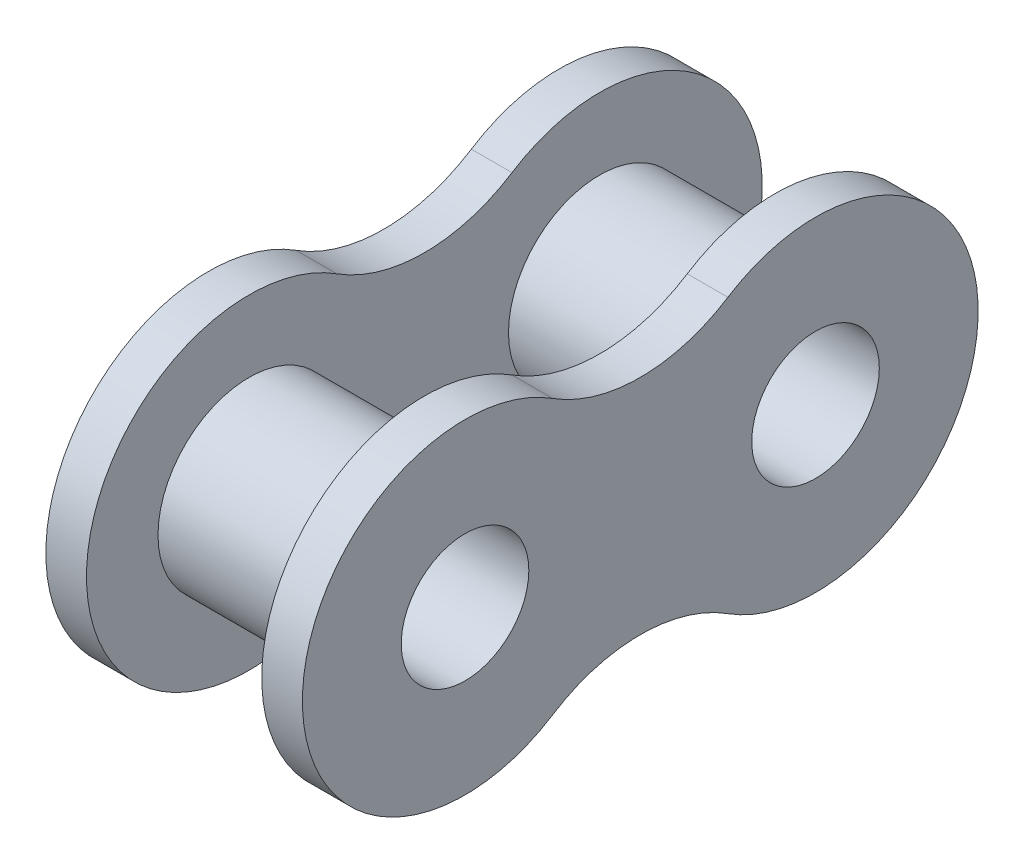
ISO-10303-21;
HEADER;
FILE_DESCRIPTION(('STEP AP214'),'2;1');
FILE_NAME('part.step','',(''),(''),'','','');
FILE_SCHEMA(('AUTOMOTIVE_DESIGN { 1 0 10303 214 1 1 1 1 }'));
ENDSEC;
DATA;
#1=APPLICATION_CONTEXT('core data for automotive mechanical design processes');
#2=APPLICATION_PROTOCOL_DEFINITION('international standard','automotive_design',2000,#1);
#3=PRODUCT_CONTEXT('',#1,'mechanical');
#4=PRODUCT('Part','Part','',(#3));
#5=PRODUCT_RELATED_PRODUCT_CATEGORY('part','',(#4));
#6=PRODUCT_DEFINITION_FORMATION('','',#4);
#7=PRODUCT_DEFINITION_CONTEXT('part definition',#1,'design');
#8=PRODUCT_DEFINITION('design','',#6,#7);
#9=PRODUCT_DEFINITION_SHAPE('','',#8);
#10=(LENGTH_UNIT() NAMED_UNIT(*) SI_UNIT(.MILLI.,.METRE.));
#11=(NAMED_UNIT(*) PLANE_ANGLE_UNIT() SI_UNIT($,.RADIAN.));
#12=(NAMED_UNIT(*) SI_UNIT($,.STERADIAN.) SOLID_ANGLE_UNIT());
#13=UNCERTAINTY_MEASURE_WITH_UNIT(LENGTH_MEASURE(1.E-05),#10,'distance_accuracy_value','');
#14=(GEOMETRIC_REPRESENTATION_CONTEXT(3) GLOBAL_UNCERTAINTY_ASSIGNED_CONTEXT((#13)) GLOBAL_UNIT_ASSIGNED_CONTEXT((#10,
#11,#12)) REPRESENTATION_CONTEXT('',''));
#15=CARTESIAN_POINT('',(0.,0.,0.));
#16=DIRECTION('',(0.,0.,1.));
#17=DIRECTION('',(1.,0.,0.));
#18=AXIS2_PLACEMENT_3D('',#15,#16,#17);
#19=CARTESIAN_POINT('',(0.7366,2.48215968664387,-4.7625));
#20=DIRECTION('',(1.,0.,0.));
#21=DIRECTION('',(0.,0.,-1.));
#22=AXIS2_PLACEMENT_3D('',#19,#20,#21);
#23=PLANE('',#22);
#24=CARTESIAN_POINT('',(0.7366,0.,0.));
#25=DIRECTION('',(1.,0.,0.));
#26=DIRECTION('',(0.,0.,-1.));
#27=AXIS2_PLACEMENT_3D('',#24,#25,#26);
#28=CIRCLE('',#27,1.651);
#29=CARTESIAN_POINT('',(0.7366,0.,-1.651));
#30=VERTEX_POINT('',#29);
#31=EDGE_CURVE('E197',#30,#30,#28,.T.);
#32=ORIENTED_EDGE('',*,*,#31,.F.);
#33=EDGE_LOOP('',(#32));
#34=FACE_BOUND('',#33,.T.);
#35=CARTESIAN_POINT('',(0.7366,4.96431937328774,-3.175));
#36=DIRECTION('',(-1.,0.,0.));
#37=DIRECTION('',(0.,0.,-1.));
#38=AXIS2_PLACEMENT_3D('',#35,#36,#37);
#39=CIRCLE('',#38,2.9464);
#40=CARTESIAN_POINT('',(0.7366,2.48215968664387,-4.7625));
#41=VERTEX_POINT('',#40);
#42=CARTESIAN_POINT('',(0.7366,2.48215968664387,-1.5875));
#43=VERTEX_POINT('',#42);
#44=EDGE_CURVE('E217',#41,#43,#39,.T.);
#45=ORIENTED_EDGE('',*,*,#44,.T.);
#46=CARTESIAN_POINT('',(0.7366,0.,0.));
#47=DIRECTION('',(1.,0.,0.));
#48=DIRECTION('',(0.,0.,-1.));
#49=AXIS2_PLACEMENT_3D('',#46,#47,#48);
#50=CIRCLE('',#49,2.9464);
#51=CARTESIAN_POINT('',(0.7366,-2.48215968664387,-1.5875));
#52=VERTEX_POINT('',#51);
#53=EDGE_CURVE('E101',#43,#52,#50,.T.);
#54=ORIENTED_EDGE('',*,*,#53,.T.);
#55=CARTESIAN_POINT('',(0.7366,-4.96431937328774,-3.175));
#56=DIRECTION('',(-1.,0.,0.));
#57=DIRECTION('',(0.,0.,1.));
#58=AXIS2_PLACEMENT_3D('',#55,#56,#57);
#59=CIRCLE('',#58,2.9464);
#60=CARTESIAN_POINT('',(0.7366,-2.48215968664387,-4.7625));
#61=VERTEX_POINT('',#60);
#62=EDGE_CURVE('E222',#52,#61,#59,.T.);
#63=ORIENTED_EDGE('',*,*,#62,.T.);
#64=CARTESIAN_POINT('',(0.7366,0.,-6.35));
#65=DIRECTION('',(1.,0.,0.));
#66=DIRECTION('',(0.,0.,-1.));
#67=AXIS2_PLACEMENT_3D('',#64,#65,#66);
#68=CIRCLE('',#67,2.9464);
#69=EDGE_CURVE('E64',#61,#41,#68,.T.);
#70=ORIENTED_EDGE('',*,*,#69,.T.);
#71=EDGE_LOOP('',(#45,#54,#63,#70));
#72=FACE_BOUND('',#71,.T.);
#73=CARTESIAN_POINT('',(0.7366,0.,-6.35));
#74=DIRECTION('',(1.,0.,0.));
#75=DIRECTION('',(0.,0.,-1.));
#76=AXIS2_PLACEMENT_3D('',#73,#74,#75);
#77=CIRCLE('',#76,1.651);
#78=CARTESIAN_POINT('',(0.7366,0.,-8.001));
#79=VERTEX_POINT('',#78);
#80=EDGE_CURVE('E193',#79,#79,#77,.T.);
#81=ORIENTED_EDGE('',*,*,#80,.F.);
#82=EDGE_LOOP('',(#81));
#83=FACE_BOUND('',#82,.T.);
#84=ADVANCED_FACE('F43',(#34,#72,#83),#23,.T.);
#85=CARTESIAN_POINT('',(0.,2.48215968664387,-4.7625));
#86=DIRECTION('',(1.,0.,0.));
#87=DIRECTION('',(0.,0.,-1.));
#88=AXIS2_PLACEMENT_3D('',#85,#86,#87);
#89=PLANE('',#88);
#90=CARTESIAN_POINT('',(0.,4.96431937328774,-3.175));
#91=DIRECTION('',(-1.,0.,0.));
#92=DIRECTION('',(0.,0.,-1.));
#93=AXIS2_PLACEMENT_3D('',#90,#91,#92);
#94=CIRCLE('',#93,2.9464);
#95=CARTESIAN_POINT('',(0.,2.48215968664387,-4.7625));
#96=VERTEX_POINT('',#95);
#97=CARTESIAN_POINT('',(0.,2.48215968664387,-1.5875));
#98=VERTEX_POINT('',#97);
#99=EDGE_CURVE('E216',#96,#98,#94,.T.);
#100=ORIENTED_EDGE('',*,*,#99,.F.);
#101=CARTESIAN_POINT('',(0.,0.,-6.35));
#102=DIRECTION('',(1.,0.,0.));
#103=DIRECTION('',(0.,0.,-1.));
#104=AXIS2_PLACEMENT_3D('',#101,#102,#103);
#105=CIRCLE('',#104,2.9464);
#106=CARTESIAN_POINT('',(0.,-2.48215968664387,-4.7625));
#107=VERTEX_POINT('',#106);
#108=EDGE_CURVE('E94',#107,#96,#105,.T.);
#109=ORIENTED_EDGE('',*,*,#108,.F.);
#110=CARTESIAN_POINT('',(0.,-4.96431937328774,-3.175));
#111=DIRECTION('',(-1.,0.,0.));
#112=DIRECTION('',(0.,0.,1.));
#113=AXIS2_PLACEMENT_3D('',#110,#111,#112);
#114=CIRCLE('',#113,2.9464);
#115=CARTESIAN_POINT('',(0.,-2.48215968664387,-1.5875));
#116=VERTEX_POINT('',#115);
#117=EDGE_CURVE('E87',#116,#107,#114,.T.);
#118=ORIENTED_EDGE('',*,*,#117,.F.);
#119=CARTESIAN_POINT('',(0.,0.,0.));
#120=DIRECTION('',(1.,0.,0.));
#121=DIRECTION('',(0.,0.,-1.));
#122=AXIS2_PLACEMENT_3D('',#119,#120,#121);
#123=CIRCLE('',#122,2.9464);
#124=EDGE_CURVE('E231',#98,#116,#123,.T.);
#125=ORIENTED_EDGE('',*,*,#124,.F.);
#126=EDGE_LOOP('',(#100,#109,#118,#125));
#127=FACE_BOUND('',#126,.T.);
#128=CARTESIAN_POINT('',(0.,0.,0.));
#129=DIRECTION('',(1.,0.,0.));
#130=DIRECTION('',(0.,0.,-1.));
#131=AXIS2_PLACEMENT_3D('',#128,#129,#130);
#132=CIRCLE('',#131,1.1557);
#133=CARTESIAN_POINT('',(0.,0.,-1.1557));
#134=VERTEX_POINT('',#133);
#135=EDGE_CURVE('E212',#134,#134,#132,.T.);
#136=ORIENTED_EDGE('',*,*,#135,.T.);
#137=EDGE_LOOP('',(#136));
#138=FACE_BOUND('',#137,.T.);
#139=CARTESIAN_POINT('',(0.,0.,-6.35));
#140=DIRECTION('',(1.,0.,0.));
#141=DIRECTION('',(0.,0.,-1.));
#142=AXIS2_PLACEMENT_3D('',#139,#140,#141);
#143=CIRCLE('',#142,1.1557);
#144=CARTESIAN_POINT('',(0.,0.,-7.5057));
#145=VERTEX_POINT('',#144);
#146=EDGE_CURVE('E205',#145,#145,#143,.T.);
#147=ORIENTED_EDGE('',*,*,#146,.T.);
#148=EDGE_LOOP('',(#147));
#149=FACE_BOUND('',#148,.T.);
#150=ADVANCED_FACE('F246',(#127,#138,#149),#89,.F.);
#151=CARTESIAN_POINT('',(0.7366,4.96431937328774,-3.175));
#152=DIRECTION('',(-1.,0.,0.));
#153=DIRECTION('',(0.,0.,1.));
#154=AXIS2_PLACEMENT_3D('',#151,#152,#153);
#155=CYLINDRICAL_SURFACE('',#154,2.9464);
#156=ORIENTED_EDGE('',*,*,#99,.T.);
#157=DIRECTION('',(-1.,0.,0.));
#158=VECTOR('',#157,1.);
#159=CARTESIAN_POINT('',(0.7366,2.48215968664387,-1.5875));
#160=LINE('',#159,#158);
#161=EDGE_CURVE('E11',#43,#98,#160,.T.);
#162=ORIENTED_EDGE('',*,*,#161,.F.);
#163=ORIENTED_EDGE('',*,*,#44,.F.);
#164=DIRECTION('',(-1.,0.,0.));
#165=VECTOR('',#164,1.);
#166=CARTESIAN_POINT('',(0.7366,2.48215968664387,-4.7625));
#167=LINE('',#166,#165);
#168=EDGE_CURVE('E227',#41,#96,#167,.T.);
#169=ORIENTED_EDGE('',*,*,#168,.T.);
#170=EDGE_LOOP('',(#156,#162,#163,#169));
#171=FACE_BOUND('',#170,.T.);
#172=ADVANCED_FACE('F45',(#171),#155,.F.);
#173=CARTESIAN_POINT('',(0.7366,0.,0.));
#174=DIRECTION('',(-1.,0.,0.));
#175=DIRECTION('',(0.,0.,1.));
#176=AXIS2_PLACEMENT_3D('',#173,#174,#175);
#177=CYLINDRICAL_SURFACE('',#176,2.9464);
#178=ORIENTED_EDGE('',*,*,#124,.T.);
#179=DIRECTION('',(-1.,0.,0.));
#180=VECTOR('',#179,1.);
#181=CARTESIAN_POINT('',(0.7366,-2.48215968664387,-1.5875));
#182=LINE('',#181,#180);
#183=EDGE_CURVE('E53',#52,#116,#182,.T.);
#184=ORIENTED_EDGE('',*,*,#183,.F.);
#185=ORIENTED_EDGE('',*,*,#53,.F.);
#186=ORIENTED_EDGE('',*,*,#161,.T.);
#187=EDGE_LOOP('',(#178,#184,#185,#186));
#188=FACE_BOUND('',#187,.T.);
#189=ADVANCED_FACE('F262',(#188),#177,.T.);
#190=CARTESIAN_POINT('',(0.7366,-4.96431937328774,-3.175));
#191=DIRECTION('',(-1.,0.,0.));
#192=DIRECTION('',(0.,0.,1.));
#193=AXIS2_PLACEMENT_3D('',#190,#191,#192);
#194=CYLINDRICAL_SURFACE('',#193,2.9464);
#195=ORIENTED_EDGE('',*,*,#117,.T.);
#196=DIRECTION('',(-1.,0.,0.));
#197=VECTOR('',#196,1.);
#198=CARTESIAN_POINT('',(0.7366,-2.48215968664387,-4.7625));
#199=LINE('',#198,#197);
#200=EDGE_CURVE('E239',#61,#107,#199,.T.);
#201=ORIENTED_EDGE('',*,*,#200,.F.);
#202=ORIENTED_EDGE('',*,*,#62,.F.);
#203=ORIENTED_EDGE('',*,*,#183,.T.);
#204=EDGE_LOOP('',(#195,#201,#202,#203));
#205=FACE_BOUND('',#204,.T.);
#206=ADVANCED_FACE('F243',(#205),#194,.F.);
#207=CARTESIAN_POINT('',(0.7366,0.,-6.35));
#208=DIRECTION('',(-1.,0.,0.));
#209=DIRECTION('',(0.,0.,1.));
#210=AXIS2_PLACEMENT_3D('',#207,#208,#209);
#211=CYLINDRICAL_SURFACE('',#210,2.9464);
#212=ORIENTED_EDGE('',*,*,#108,.T.);
#213=ORIENTED_EDGE('',*,*,#168,.F.);
#214=ORIENTED_EDGE('',*,*,#69,.F.);
#215=ORIENTED_EDGE('',*,*,#200,.T.);
#216=EDGE_LOOP('',(#212,#213,#214,#215));
#217=FACE_BOUND('',#216,.T.);
#218=ADVANCED_FACE('F251',(#217),#211,.T.);
#219=CARTESIAN_POINT('',(0.7366,0.,0.));
#220=DIRECTION('',(-1.,0.,0.));
#221=DIRECTION('',(0.,0.,1.));
#222=AXIS2_PLACEMENT_3D('',#219,#220,#221);
#223=CYLINDRICAL_SURFACE('',#222,1.1557);
#224=ORIENTED_EDGE('',*,*,#135,.F.);
#225=EDGE_LOOP('',(#224));
#226=FACE_BOUND('',#225,.T.);
#227=CARTESIAN_POINT('',(4.6482,0.,0.));
#228=DIRECTION('',(1.,0.,0.));
#229=DIRECTION('',(0.,0.,-1.));
#230=AXIS2_PLACEMENT_3D('',#227,#228,#229);
#231=CIRCLE('',#230,1.1557);
#232=CARTESIAN_POINT('',(4.6482,0.,-1.1557));
#233=VERTEX_POINT('',#232);
#234=EDGE_CURVE('E177',#233,#233,#231,.T.);
#235=ORIENTED_EDGE('',*,*,#234,.T.);
#236=EDGE_LOOP('',(#235));
#237=FACE_BOUND('',#236,.T.);
#238=ADVANCED_FACE('F253',(#226,#237),#223,.F.);
#239=CARTESIAN_POINT('',(0.7366,0.,-6.35));
#240=DIRECTION('',(-1.,0.,0.));
#241=DIRECTION('',(0.,0.,1.));
#242=AXIS2_PLACEMENT_3D('',#239,#240,#241);
#243=CYLINDRICAL_SURFACE('',#242,1.1557);
#244=ORIENTED_EDGE('',*,*,#146,.F.);
#245=EDGE_LOOP('',(#244));
#246=FACE_BOUND('',#245,.T.);
#247=CARTESIAN_POINT('',(4.6482,0.,-6.35));
#248=DIRECTION('',(1.,0.,0.));
#249=DIRECTION('',(0.,0.,-1.));
#250=AXIS2_PLACEMENT_3D('',#247,#248,#249);
#251=CIRCLE('',#250,1.1557);
#252=CARTESIAN_POINT('',(4.6482,0.,-7.5057));
#253=VERTEX_POINT('',#252);
#254=EDGE_CURVE('E462',#253,#253,#251,.T.);
#255=ORIENTED_EDGE('',*,*,#254,.T.);
#256=EDGE_LOOP('',(#255));
#257=FACE_BOUND('',#256,.T.);
#258=ADVANCED_FACE('F259',(#246,#257),#243,.F.);
#259=CARTESIAN_POINT('',(3.9116,0.,0.));
#260=DIRECTION('',(-1.,0.,0.));
#261=DIRECTION('',(0.,0.,1.));
#262=AXIS2_PLACEMENT_3D('',#259,#260,#261);
#263=CYLINDRICAL_SURFACE('',#262,1.651);
#264=CARTESIAN_POINT('',(3.9116,0.,0.));
#265=DIRECTION('',(1.,0.,0.));
#266=DIRECTION('',(0.,0.,-1.));
#267=AXIS2_PLACEMENT_3D('',#264,#265,#266);
#268=CIRCLE('',#267,1.651);
#269=CARTESIAN_POINT('',(3.9116,0.,-1.651));
#270=VERTEX_POINT('',#269);
#271=EDGE_CURVE('E201',#270,#270,#268,.T.);
#272=ORIENTED_EDGE('',*,*,#271,.F.);
#273=EDGE_LOOP('',(#272));
#274=FACE_BOUND('',#273,.T.);
#275=ORIENTED_EDGE('',*,*,#31,.T.);
#276=EDGE_LOOP('',(#275));
#277=FACE_BOUND('',#276,.T.);
#278=ADVANCED_FACE('F275',(#274,#277),#263,.T.);
#279=CARTESIAN_POINT('',(3.9116,0.,-6.35));
#280=DIRECTION('',(-1.,0.,0.));
#281=DIRECTION('',(0.,0.,1.));
#282=AXIS2_PLACEMENT_3D('',#279,#280,#281);
#283=CYLINDRICAL_SURFACE('',#282,1.651);
#284=CARTESIAN_POINT('',(3.9116,0.,-6.35));
#285=DIRECTION('',(1.,0.,0.));
#286=DIRECTION('',(0.,0.,-1.));
#287=AXIS2_PLACEMENT_3D('',#284,#285,#286);
#288=CIRCLE('',#287,1.651);
#289=CARTESIAN_POINT('',(3.9116,0.,-8.001));
#290=VERTEX_POINT('',#289);
#291=EDGE_CURVE('E147',#290,#290,#288,.T.);
#292=ORIENTED_EDGE('',*,*,#291,.F.);
#293=EDGE_LOOP('',(#292));
#294=FACE_BOUND('',#293,.T.);
#295=ORIENTED_EDGE('',*,*,#80,.T.);
#296=EDGE_LOOP('',(#295));
#297=FACE_BOUND('',#296,.T.);
#298=ADVANCED_FACE('F279',(#294,#297),#283,.T.);
#299=CARTESIAN_POINT('',(3.9116,4.96431937328774,-3.175));
#300=DIRECTION('',(1.,0.,0.));
#301=DIRECTION('',(0.,0.,-1.));
#302=AXIS2_PLACEMENT_3D('',#299,#300,#301);
#303=CYLINDRICAL_SURFACE('',#302,2.9464);
#304=CARTESIAN_POINT('',(4.6482,4.96431937328774,-3.175));
#305=DIRECTION('',(-1.,0.,0.));
#306=DIRECTION('',(0.,0.,-1.));
#307=AXIS2_PLACEMENT_3D('',#304,#305,#306);
#308=CIRCLE('',#307,2.9464);
#309=CARTESIAN_POINT('',(4.6482,2.48215968664387,-4.7625));
#310=VERTEX_POINT('',#309);
#311=CARTESIAN_POINT('',(4.6482,2.48215968664387,-1.5875));
#312=VERTEX_POINT('',#311);
#313=EDGE_CURVE('E141',#310,#312,#308,.T.);
#314=ORIENTED_EDGE('',*,*,#313,.F.);
#315=DIRECTION('',(1.,0.,0.));
#316=VECTOR('',#315,1.);
#317=CARTESIAN_POINT('',(3.9116,2.48215968664387,-4.7625));
#318=LINE('',#317,#316);
#319=CARTESIAN_POINT('',(3.9116,2.48215968664387,-4.7625));
#320=VERTEX_POINT('',#319);
#321=EDGE_CURVE('E135',#320,#310,#318,.T.);
#322=ORIENTED_EDGE('',*,*,#321,.F.);
#323=CARTESIAN_POINT('',(3.9116,4.96431937328774,-3.175));
#324=DIRECTION('',(-1.,0.,0.));
#325=DIRECTION('',(0.,0.,-1.));
#326=AXIS2_PLACEMENT_3D('',#323,#324,#325);
#327=CIRCLE('',#326,2.9464);
#328=CARTESIAN_POINT('',(3.9116,2.48215968664387,-1.5875));
#329=VERTEX_POINT('',#328);
#330=EDGE_CURVE('E138',#320,#329,#327,.T.);
#331=ORIENTED_EDGE('',*,*,#330,.T.);
#332=DIRECTION('',(1.,0.,0.));
#333=VECTOR('',#332,1.);
#334=CARTESIAN_POINT('',(3.9116,2.48215968664387,-1.5875));
#335=LINE('',#334,#333);
#336=EDGE_CURVE('E173',#329,#312,#335,.T.);
#337=ORIENTED_EDGE('',*,*,#336,.T.);
#338=EDGE_LOOP('',(#314,#322,#331,#337));
#339=FACE_BOUND('',#338,.T.);
#340=ADVANCED_FACE('F137',(#339),#303,.F.);
#341=CARTESIAN_POINT('',(3.9116,0.,-6.35));
#342=DIRECTION('',(1.,0.,0.));
#343=DIRECTION('',(0.,0.,-1.));
#344=AXIS2_PLACEMENT_3D('',#341,#342,#343);
#345=CYLINDRICAL_SURFACE('',#344,2.9464);
#346=CARTESIAN_POINT('',(4.6482,0.,-6.35));
#347=DIRECTION('',(1.,0.,0.));
#348=DIRECTION('',(0.,0.,-1.));
#349=AXIS2_PLACEMENT_3D('',#346,#347,#348);
#350=CIRCLE('',#349,2.9464);
#351=CARTESIAN_POINT('',(4.6482,-2.48215968664387,-4.7625));
#352=VERTEX_POINT('',#351);
#353=EDGE_CURVE('E176',#352,#310,#350,.T.);
#354=ORIENTED_EDGE('',*,*,#353,.F.);
#355=DIRECTION('',(1.,0.,0.));
#356=VECTOR('',#355,1.);
#357=CARTESIAN_POINT('',(3.9116,-2.48215968664387,-4.7625));
#358=LINE('',#357,#356);
#359=CARTESIAN_POINT('',(3.9116,-2.48215968664387,-4.7625));
#360=VERTEX_POINT('',#359);
#361=EDGE_CURVE('E148',#360,#352,#358,.T.);
#362=ORIENTED_EDGE('',*,*,#361,.F.);
#363=CARTESIAN_POINT('',(3.9116,0.,-6.35));
#364=DIRECTION('',(1.,0.,0.));
#365=DIRECTION('',(0.,0.,-1.));
#366=AXIS2_PLACEMENT_3D('',#363,#364,#365);
#367=CIRCLE('',#366,2.9464);
#368=EDGE_CURVE('E154',#360,#320,#367,.T.);
#369=ORIENTED_EDGE('',*,*,#368,.T.);
#370=ORIENTED_EDGE('',*,*,#321,.T.);
#371=EDGE_LOOP('',(#354,#362,#369,#370));
#372=FACE_BOUND('',#371,.T.);
#373=ADVANCED_FACE('F161',(#372),#345,.T.);
#374=CARTESIAN_POINT('',(3.9116,-4.96431937328774,-3.175));
#375=DIRECTION('',(1.,0.,0.));
#376=DIRECTION('',(0.,0.,-1.));
#377=AXIS2_PLACEMENT_3D('',#374,#375,#376);
#378=CYLINDRICAL_SURFACE('',#377,2.9464);
#379=CARTESIAN_POINT('',(4.6482,-4.96431937328774,-3.175));
#380=DIRECTION('',(-1.,0.,0.));
#381=DIRECTION('',(0.,0.,1.));
#382=AXIS2_PLACEMENT_3D('',#379,#380,#381);
#383=CIRCLE('',#382,2.9464);
#384=CARTESIAN_POINT('',(4.6482,-2.48215968664387,-1.5875));
#385=VERTEX_POINT('',#384);
#386=EDGE_CURVE('E179',#385,#352,#383,.T.);
#387=ORIENTED_EDGE('',*,*,#386,.F.);
#388=DIRECTION('',(1.,0.,0.));
#389=VECTOR('',#388,1.);
#390=CARTESIAN_POINT('',(3.9116,-2.48215968664387,-1.5875));
#391=LINE('',#390,#389);
#392=CARTESIAN_POINT('',(3.9116,-2.48215968664387,-1.5875));
#393=VERTEX_POINT('',#392);
#394=EDGE_CURVE('E188',#393,#385,#391,.T.);
#395=ORIENTED_EDGE('',*,*,#394,.F.);
#396=CARTESIAN_POINT('',(3.9116,-4.96431937328774,-3.175));
#397=DIRECTION('',(-1.,0.,0.));
#398=DIRECTION('',(0.,0.,1.));
#399=AXIS2_PLACEMENT_3D('',#396,#397,#398);
#400=CIRCLE('',#399,2.9464);
#401=EDGE_CURVE('E163',#393,#360,#400,.T.);
#402=ORIENTED_EDGE('',*,*,#401,.T.);
#403=ORIENTED_EDGE('',*,*,#361,.T.);
#404=EDGE_LOOP('',(#387,#395,#402,#403));
#405=FACE_BOUND('',#404,.T.);
#406=ADVANCED_FACE('F288',(#405),#378,.F.);
#407=CARTESIAN_POINT('',(3.9116,0.,0.));
#408=DIRECTION('',(1.,0.,0.));
#409=DIRECTION('',(0.,0.,-1.));
#410=AXIS2_PLACEMENT_3D('',#407,#408,#409);
#411=CYLINDRICAL_SURFACE('',#410,2.9464);
#412=CARTESIAN_POINT('',(4.6482,0.,0.));
#413=DIRECTION('',(1.,0.,0.));
#414=DIRECTION('',(0.,0.,-1.));
#415=AXIS2_PLACEMENT_3D('',#412,#413,#414);
#416=CIRCLE('',#415,2.9464);
#417=EDGE_CURVE('E159',#312,#385,#416,.T.);
#418=ORIENTED_EDGE('',*,*,#417,.F.);
#419=ORIENTED_EDGE('',*,*,#336,.F.);
#420=CARTESIAN_POINT('',(3.9116,0.,0.));
#421=DIRECTION('',(1.,0.,0.));
#422=DIRECTION('',(0.,0.,-1.));
#423=AXIS2_PLACEMENT_3D('',#420,#421,#422);
#424=CIRCLE('',#423,2.9464);
#425=EDGE_CURVE('E157',#329,#393,#424,.T.);
#426=ORIENTED_EDGE('',*,*,#425,.T.);
#427=ORIENTED_EDGE('',*,*,#394,.T.);
#428=EDGE_LOOP('',(#418,#419,#426,#427));
#429=FACE_BOUND('',#428,.T.);
#430=ADVANCED_FACE('F291',(#429),#411,.T.);
#431=CARTESIAN_POINT('',(3.9116,2.48215968664387,-4.7625));
#432=DIRECTION('',(-1.,0.,0.));
#433=DIRECTION('',(0.,0.,-1.));
#434=AXIS2_PLACEMENT_3D('',#431,#432,#433);
#435=PLANE('',#434);
#436=ORIENTED_EDGE('',*,*,#271,.T.);
#437=EDGE_LOOP('',(#436));
#438=FACE_BOUND('',#437,.T.);
#439=ORIENTED_EDGE('',*,*,#291,.T.);
#440=EDGE_LOOP('',(#439));
#441=FACE_BOUND('',#440,.T.);
#442=ORIENTED_EDGE('',*,*,#330,.F.);
#443=ORIENTED_EDGE('',*,*,#368,.F.);
#444=ORIENTED_EDGE('',*,*,#401,.F.);
#445=ORIENTED_EDGE('',*,*,#425,.F.);
#446=EDGE_LOOP('',(#442,#443,#444,#445));
#447=FACE_BOUND('',#446,.T.);
#448=ADVANCED_FACE('F152',(#438,#441,#447),#435,.T.);
#449=CARTESIAN_POINT('',(4.6482,2.48215968664387,-4.7625));
#450=DIRECTION('',(-1.,0.,0.));
#451=DIRECTION('',(0.,0.,-1.));
#452=AXIS2_PLACEMENT_3D('',#449,#450,#451);
#453=PLANE('',#452);
#454=ORIENTED_EDGE('',*,*,#254,.F.);
#455=EDGE_LOOP('',(#454));
#456=FACE_BOUND('',#455,.T.);
#457=ORIENTED_EDGE('',*,*,#234,.F.);
#458=EDGE_LOOP('',(#457));
#459=FACE_BOUND('',#458,.T.);
#460=ORIENTED_EDGE('',*,*,#313,.T.);
#461=ORIENTED_EDGE('',*,*,#417,.T.);
#462=ORIENTED_EDGE('',*,*,#386,.T.);
#463=ORIENTED_EDGE('',*,*,#353,.T.);
#464=EDGE_LOOP('',(#460,#461,#462,#463));
#465=FACE_BOUND('',#464,.T.);
#466=ADVANCED_FACE('F296',(#456,#459,#465),#453,.F.);
#467=CLOSED_SHELL('',(#84,#150,#172,#189,#206,#218,#238,#258,#278,#298,#340,#373,#406,#430,#448,#466));
#468=MANIFOLD_SOLID_BREP('B2',#467);
#469=ADVANCED_BREP_SHAPE_REPRESENTATION('',(#18,#468),#14);
#470=SHAPE_DEFINITION_REPRESENTATION(#9,#469);
ENDSEC;
END-ISO-10303-21;
